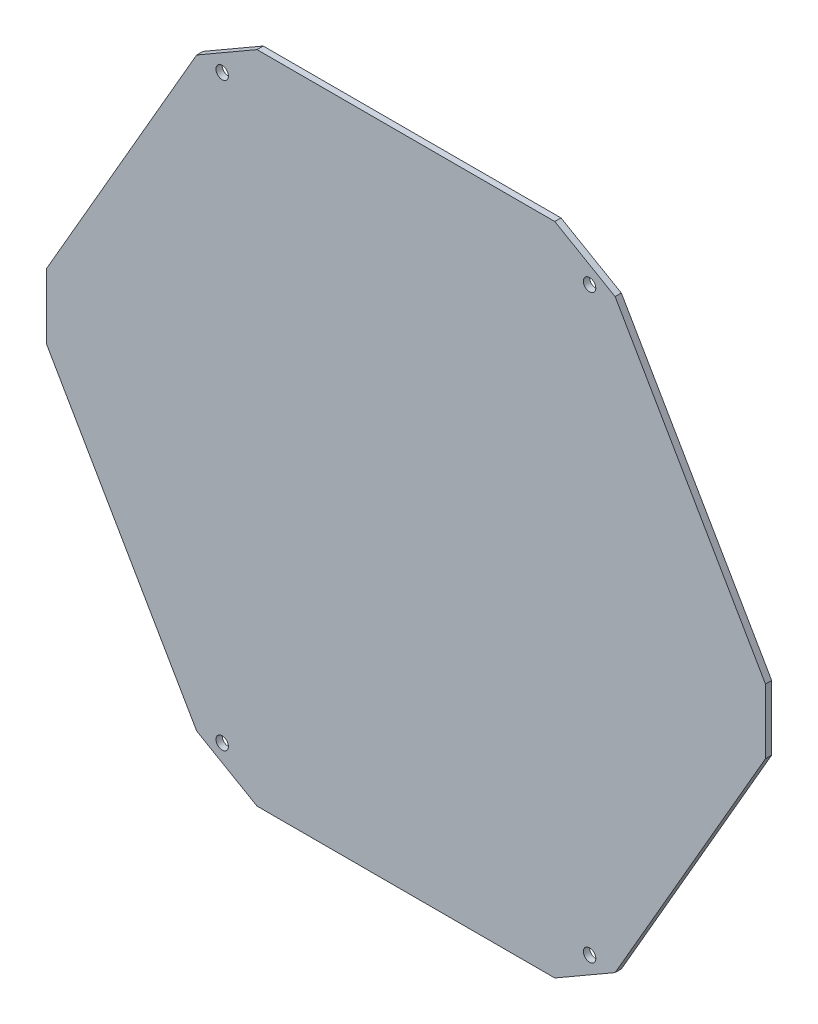
ISO-10303-21;
HEADER;
FILE_DESCRIPTION(('STEP AP214'),'2;1');
FILE_NAME('part.step','',(''),(''),'','','');
FILE_SCHEMA(('AUTOMOTIVE_DESIGN { 1 0 10303 214 1 1 1 1 }'));
ENDSEC;
DATA;
#1=APPLICATION_CONTEXT('core data for automotive mechanical design processes');
#2=APPLICATION_PROTOCOL_DEFINITION('international standard','automotive_design',2000,#1);
#3=PRODUCT_CONTEXT('',#1,'mechanical');
#4=PRODUCT('Part','Part','',(#3));
#5=PRODUCT_RELATED_PRODUCT_CATEGORY('part','',(#4));
#6=PRODUCT_DEFINITION_FORMATION('','',#4);
#7=PRODUCT_DEFINITION_CONTEXT('part definition',#1,'design');
#8=PRODUCT_DEFINITION('design','',#6,#7);
#9=PRODUCT_DEFINITION_SHAPE('','',#8);
#10=(LENGTH_UNIT() NAMED_UNIT(*) SI_UNIT(.MILLI.,.METRE.));
#11=(NAMED_UNIT(*) PLANE_ANGLE_UNIT() SI_UNIT($,.RADIAN.));
#12=(NAMED_UNIT(*) SI_UNIT($,.STERADIAN.) SOLID_ANGLE_UNIT());
#13=UNCERTAINTY_MEASURE_WITH_UNIT(LENGTH_MEASURE(1.E-05),#10,'distance_accuracy_value','');
#14=(GEOMETRIC_REPRESENTATION_CONTEXT(3) GLOBAL_UNCERTAINTY_ASSIGNED_CONTEXT((#13)) GLOBAL_UNIT_ASSIGNED_CONTEXT((#10,
#11,#12)) REPRESENTATION_CONTEXT('',''));
#15=CARTESIAN_POINT('',(0.,0.,0.));
#16=DIRECTION('',(0.,0.,1.));
#17=DIRECTION('',(1.,0.,0.));
#18=AXIS2_PLACEMENT_3D('',#15,#16,#17);
#19=CARTESIAN_POINT('',(0.,0.,2.));
#20=DIRECTION('',(0.,0.,1.));
#21=DIRECTION('',(1.,0.,0.));
#22=AXIS2_PLACEMENT_3D('',#19,#20,#21);
#23=PLANE('',#22);
#24=CARTESIAN_POINT('',(121.525932205,14.9827380707,2.));
#25=DIRECTION('',(0.,0.,1.));
#26=DIRECTION('',(1.,0.,0.));
#27=AXIS2_PLACEMENT_3D('',#24,#25,#26);
#28=CIRCLE('',#27,2.);
#29=CARTESIAN_POINT('',(123.525932205,14.9827380707,2.));
#30=VERTEX_POINT('',#29);
#31=EDGE_CURVE('E142',#30,#30,#28,.F.);
#32=ORIENTED_EDGE('',*,*,#31,.T.);
#33=EDGE_LOOP('',(#32));
#34=FACE_BOUND('',#33,.T.);
#35=CARTESIAN_POINT('',(3.47406779464,14.9827380707,2.));
#36=DIRECTION('',(0.,0.,1.));
#37=DIRECTION('',(1.,0.,0.));
#38=AXIS2_PLACEMENT_3D('',#35,#36,#37);
#39=CIRCLE('',#38,2.);
#40=CARTESIAN_POINT('',(5.47406779464,14.9827380707,2.));
#41=VERTEX_POINT('',#40);
#42=EDGE_CURVE('E145',#41,#41,#39,.F.);
#43=ORIENTED_EDGE('',*,*,#42,.T.);
#44=EDGE_LOOP('',(#43));
#45=FACE_BOUND('',#44,.T.);
#46=CARTESIAN_POINT('',(121.525932205,201.523612875,2.));
#47=DIRECTION('',(0.,0.,1.));
#48=DIRECTION('',(1.,0.,0.));
#49=AXIS2_PLACEMENT_3D('',#46,#47,#48);
#50=CIRCLE('',#49,2.);
#51=CARTESIAN_POINT('',(123.525932205,201.523612875,2.));
#52=VERTEX_POINT('',#51);
#53=EDGE_CURVE('E147',#52,#52,#50,.F.);
#54=ORIENTED_EDGE('',*,*,#53,.T.);
#55=EDGE_LOOP('',(#54));
#56=FACE_BOUND('',#55,.T.);
#57=CARTESIAN_POINT('',(3.47406779464,201.523612875,2.));
#58=DIRECTION('',(0.,0.,1.));
#59=DIRECTION('',(1.,0.,0.));
#60=AXIS2_PLACEMENT_3D('',#57,#58,#59);
#61=CIRCLE('',#60,2.);
#62=CARTESIAN_POINT('',(5.47406779464,201.523612875,2.));
#63=VERTEX_POINT('',#62);
#64=EDGE_CURVE('E20',#63,#63,#61,.F.);
#65=ORIENTED_EDGE('',*,*,#64,.T.);
#66=EDGE_LOOP('',(#65));
#67=FACE_BOUND('',#66,.T.);
#68=DIRECTION('',(0.866025403784329,0.50000000000019,0.));
#69=VECTOR('',#68,1.);
#70=CARTESIAN_POINT('',(-4.73205080757,202.310198523,2.));
#71=LINE('',#70,#69);
#72=CARTESIAN_POINT('',(14.6602540378338,213.506350945941,2.));
#73=VERTEX_POINT('',#72);
#74=CARTESIAN_POINT('',(-4.73205080756524,202.310198522997,2.));
#75=VERTEX_POINT('',#74);
#76=EDGE_CURVE('E166',#73,#75,#71,.F.);
#77=ORIENTED_EDGE('',*,*,#76,.T.);
#78=DIRECTION('',(0.50000000000019,0.866025403784329,0.));
#79=VECTOR('',#78,1.);
#80=CARTESIAN_POINT('',(-53.0358983849,118.645480318,2.));
#81=LINE('',#80,#79);
#82=CARTESIAN_POINT('',(-53.0358983849,118.645480318,2.));
#83=VERTEX_POINT('',#82);
#84=EDGE_CURVE('E121',#75,#83,#81,.F.);
#85=ORIENTED_EDGE('',*,*,#84,.T.);
#86=DIRECTION('',(0.,1.,0.));
#87=VECTOR('',#86,1.);
#88=CARTESIAN_POINT('',(-53.0358983849,97.8608706276,2.));
#89=LINE('',#88,#87);
#90=CARTESIAN_POINT('',(-53.0358983848939,97.8608706276035,2.));
#91=VERTEX_POINT('',#90);
#92=EDGE_CURVE('E117',#83,#91,#89,.F.);
#93=ORIENTED_EDGE('',*,*,#92,.T.);
#94=DIRECTION('',(-0.50000000000019,0.866025403784329,0.));
#95=VECTOR('',#94,1.);
#96=CARTESIAN_POINT('',(-4.73205080757,14.1961524227,2.));
#97=LINE('',#96,#95);
#98=CARTESIAN_POINT('',(-4.73205080757138,14.1961524226976,2.));
#99=VERTEX_POINT('',#98);
#100=EDGE_CURVE('E108',#91,#99,#97,.F.);
#101=ORIENTED_EDGE('',*,*,#100,.T.);
#102=DIRECTION('',(-0.866025403784329,0.50000000000019,0.));
#103=VECTOR('',#102,1.);
#104=CARTESIAN_POINT('',(14.6602540378,3.,2.));
#105=LINE('',#104,#103);
#106=CARTESIAN_POINT('',(14.6602540378,3.,2.));
#107=VERTEX_POINT('',#106);
#108=EDGE_CURVE('E103',#99,#107,#105,.F.);
#109=ORIENTED_EDGE('',*,*,#108,.T.);
#110=DIRECTION('',(-1.,0.,0.));
#111=VECTOR('',#110,1.);
#112=CARTESIAN_POINT('',(110.339745962,3.,2.));
#113=LINE('',#112,#111);
#114=CARTESIAN_POINT('',(110.339745962038,2.99999999993418,2.));
#115=VERTEX_POINT('',#114);
#116=EDGE_CURVE('E206',#107,#115,#113,.F.);
#117=ORIENTED_EDGE('',*,*,#116,.T.);
#118=DIRECTION('',(-0.866025403784329,-0.50000000000019,0.));
#119=VECTOR('',#118,1.);
#120=CARTESIAN_POINT('',(129.732050808,14.1961524227,2.));
#121=LINE('',#120,#119);
#122=CARTESIAN_POINT('',(129.732050807944,14.1961524227322,2.));
#123=VERTEX_POINT('',#122);
#124=EDGE_CURVE('E201',#115,#123,#121,.F.);
#125=ORIENTED_EDGE('',*,*,#124,.T.);
#126=DIRECTION('',(-0.50000000000019,-0.866025403784329,0.));
#127=VECTOR('',#126,1.);
#128=CARTESIAN_POINT('',(178.035898385,97.8608706276,2.));
#129=LINE('',#128,#127);
#130=CARTESIAN_POINT('',(178.035898385,97.8608706276,2.));
#131=VERTEX_POINT('',#130);
#132=EDGE_CURVE('E195',#123,#131,#129,.F.);
#133=ORIENTED_EDGE('',*,*,#132,.T.);
#134=DIRECTION('',(0.,1.,0.));
#135=VECTOR('',#134,1.);
#136=CARTESIAN_POINT('',(178.035898385,118.645480318,2.));
#137=LINE('',#136,#135);
#138=CARTESIAN_POINT('',(178.035898385067,118.645480318038,2.));
#139=VERTEX_POINT('',#138);
#140=EDGE_CURVE('E189',#131,#139,#137,.T.);
#141=ORIENTED_EDGE('',*,*,#140,.T.);
#142=DIRECTION('',(0.50000000000019,-0.866025403784329,0.));
#143=VECTOR('',#142,1.);
#144=CARTESIAN_POINT('',(129.732050808,202.310198523,2.));
#145=LINE('',#144,#143);
#146=CARTESIAN_POINT('',(129.732050807994,202.31019852299,2.));
#147=VERTEX_POINT('',#146);
#148=EDGE_CURVE('E183',#139,#147,#145,.F.);
#149=ORIENTED_EDGE('',*,*,#148,.T.);
#150=DIRECTION('',(0.866025403784329,-0.50000000000019,0.));
#151=VECTOR('',#150,1.);
#152=CARTESIAN_POINT('',(110.339745962,213.506350946,2.));
#153=LINE('',#152,#151);
#154=CARTESIAN_POINT('',(110.339745962,213.506350946,2.));
#155=VERTEX_POINT('',#154);
#156=EDGE_CURVE('E177',#147,#155,#153,.F.);
#157=ORIENTED_EDGE('',*,*,#156,.T.);
#158=DIRECTION('',(1.,0.,0.));
#159=VECTOR('',#158,1.);
#160=CARTESIAN_POINT('',(14.6602540378,213.506350946,2.));
#161=LINE('',#160,#159);
#162=EDGE_CURVE('E171',#155,#73,#161,.F.);
#163=ORIENTED_EDGE('',*,*,#162,.T.);
#164=EDGE_LOOP('',(#77,#85,#93,#101,#109,#117,#125,#133,#141,#149,#157,#163));
#165=FACE_BOUND('',#164,.T.);
#166=ADVANCED_FACE('F17',(#34,#45,#56,#67,#165),#23,.T.);
#167=CARTESIAN_POINT('',(-53.0358983849,97.8608706276,0.));
#168=DIRECTION('',(1.,0.,0.));
#169=DIRECTION('',(0.,0.,-1.));
#170=AXIS2_PLACEMENT_3D('',#167,#168,#169);
#171=PLANE('',#170);
#172=DIRECTION('',(0.,1.,0.));
#173=VECTOR('',#172,1.);
#174=CARTESIAN_POINT('',(-53.0358983849,0.,0.));
#175=LINE('',#174,#173);
#176=CARTESIAN_POINT('',(-53.0358983849,118.645480318,0.));
#177=VERTEX_POINT('',#176);
#178=CARTESIAN_POINT('',(-53.0358983848939,97.8608706276035,0.));
#179=VERTEX_POINT('',#178);
#180=EDGE_CURVE('E128',#177,#179,#175,.F.);
#181=ORIENTED_EDGE('',*,*,#180,.T.);
#182=DIRECTION('',(0.,0.,1.));
#183=VECTOR('',#182,1.);
#184=CARTESIAN_POINT('',(-53.0358983848758,97.860870627614,0.));
#185=LINE('',#184,#183);
#186=EDGE_CURVE('E113',#179,#91,#185,.T.);
#187=ORIENTED_EDGE('',*,*,#186,.T.);
#188=ORIENTED_EDGE('',*,*,#92,.F.);
#189=DIRECTION('',(0.,0.,1.));
#190=VECTOR('',#189,1.);
#191=CARTESIAN_POINT('',(-53.0358983849,118.645480318,0.));
#192=LINE('',#191,#190);
#193=EDGE_CURVE('E154',#83,#177,#192,.F.);
#194=ORIENTED_EDGE('',*,*,#193,.T.);
#195=EDGE_LOOP('',(#181,#187,#188,#194));
#196=FACE_BOUND('',#195,.T.);
#197=ADVANCED_FACE('F127',(#196),#171,.F.);
#198=CARTESIAN_POINT('',(-4.73205080757,14.1961524227,0.));
#199=DIRECTION('',(0.866025403784329,0.50000000000019,0.));
#200=DIRECTION('',(-0.50000000000019,0.866025403784329,0.));
#201=AXIS2_PLACEMENT_3D('',#198,#199,#200);
#202=PLANE('',#201);
#203=DIRECTION('',(0.500000000000441,-0.866025403784184,0.));
#204=VECTOR('',#203,1.);
#205=CARTESIAN_POINT('',(-53.0358983849,97.8608706276,0.));
#206=LINE('',#205,#204);
#207=CARTESIAN_POINT('',(-4.73205080757138,14.1961524226976,0.));
#208=VERTEX_POINT('',#207);
#209=EDGE_CURVE('E234',#179,#208,#206,.T.);
#210=ORIENTED_EDGE('',*,*,#209,.T.);
#211=DIRECTION('',(0.,0.,1.));
#212=VECTOR('',#211,1.);
#213=CARTESIAN_POINT('',(-4.73205080757549,14.1961524226905,0.));
#214=LINE('',#213,#212);
#215=EDGE_CURVE('E115',#208,#99,#214,.T.);
#216=ORIENTED_EDGE('',*,*,#215,.T.);
#217=ORIENTED_EDGE('',*,*,#100,.F.);
#218=ORIENTED_EDGE('',*,*,#186,.F.);
#219=EDGE_LOOP('',(#210,#216,#217,#218));
#220=FACE_BOUND('',#219,.T.);
#221=ADVANCED_FACE('F111',(#220),#202,.F.);
#222=CARTESIAN_POINT('',(14.6602540378,3.,0.));
#223=DIRECTION('',(0.50000000000019,0.866025403784329,0.));
#224=DIRECTION('',(-0.866025403784329,0.50000000000019,0.));
#225=AXIS2_PLACEMENT_3D('',#222,#223,#224);
#226=PLANE('',#225);
#227=DIRECTION('',(0.866025403784084,-0.500000000000615,0.));
#228=VECTOR('',#227,1.);
#229=CARTESIAN_POINT('',(-4.73205080757,14.1961524227,0.));
#230=LINE('',#229,#228);
#231=CARTESIAN_POINT('',(14.6602540378,3.,0.));
#232=VERTEX_POINT('',#231);
#233=EDGE_CURVE('E230',#208,#232,#230,.T.);
#234=ORIENTED_EDGE('',*,*,#233,.T.);
#235=DIRECTION('',(0.,0.,1.));
#236=VECTOR('',#235,1.);
#237=CARTESIAN_POINT('',(14.6602540378,2.99999999999999,0.));
#238=LINE('',#237,#236);
#239=EDGE_CURVE('E204',#232,#107,#238,.T.);
#240=ORIENTED_EDGE('',*,*,#239,.T.);
#241=ORIENTED_EDGE('',*,*,#108,.F.);
#242=ORIENTED_EDGE('',*,*,#215,.F.);
#243=EDGE_LOOP('',(#234,#240,#241,#242));
#244=FACE_BOUND('',#243,.T.);
#245=ADVANCED_FACE('F235',(#244),#226,.F.);
#246=CARTESIAN_POINT('',(110.339745962,3.,0.));
#247=DIRECTION('',(0.,1.,0.));
#248=DIRECTION('',(-1.,0.,0.));
#249=AXIS2_PLACEMENT_3D('',#246,#247,#248);
#250=PLANE('',#249);
#251=DIRECTION('',(1.,0.,0.));
#252=VECTOR('',#251,1.);
#253=CARTESIAN_POINT('',(0.,3.,0.));
#254=LINE('',#253,#252);
#255=CARTESIAN_POINT('',(110.339745962038,2.99999999993418,0.));
#256=VERTEX_POINT('',#255);
#257=EDGE_CURVE('E212',#232,#256,#254,.T.);
#258=ORIENTED_EDGE('',*,*,#257,.T.);
#259=DIRECTION('',(0.,0.,1.));
#260=VECTOR('',#259,1.);
#261=CARTESIAN_POINT('',(110.339745962152,2.99999999973671,0.));
#262=LINE('',#261,#260);
#263=EDGE_CURVE('E198',#256,#115,#262,.T.);
#264=ORIENTED_EDGE('',*,*,#263,.T.);
#265=ORIENTED_EDGE('',*,*,#116,.F.);
#266=ORIENTED_EDGE('',*,*,#239,.F.);
#267=EDGE_LOOP('',(#258,#264,#265,#266));
#268=FACE_BOUND('',#267,.T.);
#269=ADVANCED_FACE('F210',(#268),#250,.F.);
#270=CARTESIAN_POINT('',(129.732050808,14.1961524227,0.));
#271=DIRECTION('',(-0.50000000000019,0.866025403784329,0.));
#272=DIRECTION('',(-0.866025403784329,-0.50000000000019,0.));
#273=AXIS2_PLACEMENT_3D('',#270,#271,#272);
#274=PLANE('',#273);
#275=DIRECTION('',(0.866025403791117,0.499999999988432,0.));
#276=VECTOR('',#275,1.);
#277=CARTESIAN_POINT('',(110.339745962,3.,0.));
#278=LINE('',#277,#276);
#279=CARTESIAN_POINT('',(129.732050807944,14.1961524227322,0.));
#280=VERTEX_POINT('',#279);
#281=EDGE_CURVE('E217',#256,#280,#278,.T.);
#282=ORIENTED_EDGE('',*,*,#281,.T.);
#283=DIRECTION('',(0.,0.,1.));
#284=VECTOR('',#283,1.);
#285=CARTESIAN_POINT('',(129.732050807777,14.1961524228289,0.));
#286=LINE('',#285,#284);
#287=EDGE_CURVE('E192',#280,#123,#286,.T.);
#288=ORIENTED_EDGE('',*,*,#287,.T.);
#289=ORIENTED_EDGE('',*,*,#124,.F.);
#290=ORIENTED_EDGE('',*,*,#263,.F.);
#291=EDGE_LOOP('',(#282,#288,#289,#290));
#292=FACE_BOUND('',#291,.T.);
#293=ADVANCED_FACE('F216',(#292),#274,.F.);
#294=CARTESIAN_POINT('',(178.035898385,97.8608706276,0.));
#295=DIRECTION('',(-0.866025403784329,0.50000000000019,0.));
#296=DIRECTION('',(-0.50000000000019,-0.866025403784329,0.));
#297=AXIS2_PLACEMENT_3D('',#294,#295,#296);
#298=PLANE('',#297);
#299=DIRECTION('',(0.499999999997879,0.866025403785663,0.));
#300=VECTOR('',#299,1.);
#301=CARTESIAN_POINT('',(129.732050808,14.1961524227,0.));
#302=LINE('',#301,#300);
#303=CARTESIAN_POINT('',(178.035898385,97.8608706276,0.));
#304=VERTEX_POINT('',#303);
#305=EDGE_CURVE('E226',#280,#304,#302,.T.);
#306=ORIENTED_EDGE('',*,*,#305,.T.);
#307=DIRECTION('',(0.,0.,1.));
#308=VECTOR('',#307,1.);
#309=CARTESIAN_POINT('',(178.035898385,97.8608706276,0.));
#310=LINE('',#309,#308);
#311=EDGE_CURVE('E186',#304,#131,#310,.T.);
#312=ORIENTED_EDGE('',*,*,#311,.T.);
#313=ORIENTED_EDGE('',*,*,#132,.F.);
#314=ORIENTED_EDGE('',*,*,#287,.F.);
#315=EDGE_LOOP('',(#306,#312,#313,#314));
#316=FACE_BOUND('',#315,.T.);
#317=ADVANCED_FACE('F290',(#316),#298,.F.);
#318=CARTESIAN_POINT('',(178.035898385,118.645480318,0.));
#319=DIRECTION('',(-1.,0.,0.));
#320=DIRECTION('',(0.,0.,1.));
#321=AXIS2_PLACEMENT_3D('',#318,#319,#320);
#322=PLANE('',#321);
#323=DIRECTION('',(0.,1.,0.));
#324=VECTOR('',#323,1.);
#325=CARTESIAN_POINT('',(178.035898385,0.,0.));
#326=LINE('',#325,#324);
#327=CARTESIAN_POINT('',(178.035898385067,118.645480318038,0.));
#328=VERTEX_POINT('',#327);
#329=EDGE_CURVE('E228',#304,#328,#326,.T.);
#330=ORIENTED_EDGE('',*,*,#329,.T.);
#331=DIRECTION('',(0.,0.,1.));
#332=VECTOR('',#331,1.);
#333=CARTESIAN_POINT('',(178.035898385267,118.645480318154,0.));
#334=LINE('',#333,#332);
#335=EDGE_CURVE('E180',#328,#139,#334,.T.);
#336=ORIENTED_EDGE('',*,*,#335,.T.);
#337=ORIENTED_EDGE('',*,*,#140,.F.);
#338=ORIENTED_EDGE('',*,*,#311,.F.);
#339=EDGE_LOOP('',(#330,#336,#337,#338));
#340=FACE_BOUND('',#339,.T.);
#341=ADVANCED_FACE('F286',(#340),#322,.F.);
#342=CARTESIAN_POINT('',(129.732050808,202.310198523,0.));
#343=DIRECTION('',(-0.866025403784329,-0.50000000000019,0.));
#344=DIRECTION('',(0.50000000000019,-0.866025403784329,0.));
#345=AXIS2_PLACEMENT_3D('',#342,#343,#344);
#346=PLANE('',#345);
#347=DIRECTION('',(-0.499999999997431,0.866025403785922,0.));
#348=VECTOR('',#347,1.);
#349=CARTESIAN_POINT('',(178.035898385,118.645480318,0.));
#350=LINE('',#349,#348);
#351=CARTESIAN_POINT('',(129.732050807994,202.31019852299,0.));
#352=VERTEX_POINT('',#351);
#353=EDGE_CURVE('E418',#328,#352,#350,.T.);
#354=ORIENTED_EDGE('',*,*,#353,.T.);
#355=DIRECTION('',(0.,0.,1.));
#356=VECTOR('',#355,1.);
#357=CARTESIAN_POINT('',(129.732050807978,202.310198522962,0.));
#358=LINE('',#357,#356);
#359=EDGE_CURVE('E174',#352,#147,#358,.T.);
#360=ORIENTED_EDGE('',*,*,#359,.T.);
#361=ORIENTED_EDGE('',*,*,#148,.F.);
#362=ORIENTED_EDGE('',*,*,#335,.F.);
#363=EDGE_LOOP('',(#354,#360,#361,#362));
#364=FACE_BOUND('',#363,.T.);
#365=ADVANCED_FACE('F282',(#364),#346,.F.);
#366=CARTESIAN_POINT('',(110.339745962,213.506350946,0.));
#367=DIRECTION('',(-0.50000000000019,-0.866025403784329,0.));
#368=DIRECTION('',(0.866025403784329,-0.50000000000019,0.));
#369=AXIS2_PLACEMENT_3D('',#366,#367,#368);
#370=PLANE('',#369);
#371=DIRECTION('',(-0.866025403785316,0.49999999999848,0.));
#372=VECTOR('',#371,1.);
#373=CARTESIAN_POINT('',(129.732050808,202.310198523,0.));
#374=LINE('',#373,#372);
#375=CARTESIAN_POINT('',(110.339745962,213.506350946,0.));
#376=VERTEX_POINT('',#375);
#377=EDGE_CURVE('E422',#352,#376,#374,.T.);
#378=ORIENTED_EDGE('',*,*,#377,.T.);
#379=DIRECTION('',(0.,0.,-1.));
#380=VECTOR('',#379,1.);
#381=CARTESIAN_POINT('',(110.339745962,213.506350946,0.));
#382=LINE('',#381,#380);
#383=EDGE_CURVE('E168',#376,#155,#382,.F.);
#384=ORIENTED_EDGE('',*,*,#383,.T.);
#385=ORIENTED_EDGE('',*,*,#156,.F.);
#386=ORIENTED_EDGE('',*,*,#359,.F.);
#387=EDGE_LOOP('',(#378,#384,#385,#386));
#388=FACE_BOUND('',#387,.T.);
#389=ADVANCED_FACE('F278',(#388),#370,.F.);
#390=CARTESIAN_POINT('',(14.6602540378,213.506350946,0.));
#391=DIRECTION('',(0.,-1.,0.));
#392=DIRECTION('',(0.,0.,-1.));
#393=AXIS2_PLACEMENT_3D('',#390,#391,#392);
#394=PLANE('',#393);
#395=DIRECTION('',(1.,0.,0.));
#396=VECTOR('',#395,1.);
#397=CARTESIAN_POINT('',(0.,213.506350946,0.));
#398=LINE('',#397,#396);
#399=CARTESIAN_POINT('',(14.6602540378338,213.506350945941,0.));
#400=VERTEX_POINT('',#399);
#401=EDGE_CURVE('E424',#376,#400,#398,.F.);
#402=ORIENTED_EDGE('',*,*,#401,.T.);
#403=DIRECTION('',(0.,0.,1.));
#404=VECTOR('',#403,1.);
#405=CARTESIAN_POINT('',(14.6602540379354,213.506350945766,0.));
#406=LINE('',#405,#404);
#407=EDGE_CURVE('E163',#400,#73,#406,.T.);
#408=ORIENTED_EDGE('',*,*,#407,.T.);
#409=ORIENTED_EDGE('',*,*,#162,.F.);
#410=ORIENTED_EDGE('',*,*,#383,.F.);
#411=EDGE_LOOP('',(#402,#408,#409,#410));
#412=FACE_BOUND('',#411,.T.);
#413=ADVANCED_FACE('F275',(#412),#394,.F.);
#414=CARTESIAN_POINT('',(-4.73205080757,202.310198523,0.));
#415=DIRECTION('',(0.50000000000019,-0.866025403784329,0.));
#416=DIRECTION('',(0.866025403784329,0.50000000000019,0.));
#417=AXIS2_PLACEMENT_3D('',#414,#415,#416);
#418=PLANE('',#417);
#419=DIRECTION('',(-0.866025403778283,-0.500000000010663,0.));
#420=VECTOR('',#419,1.);
#421=CARTESIAN_POINT('',(14.6602540378,213.506350946,0.));
#422=LINE('',#421,#420);
#423=CARTESIAN_POINT('',(-4.73205080756524,202.310198522997,0.));
#424=VERTEX_POINT('',#423);
#425=EDGE_CURVE('E429',#400,#424,#422,.T.);
#426=ORIENTED_EDGE('',*,*,#425,.T.);
#427=DIRECTION('',(0.,0.,1.));
#428=VECTOR('',#427,1.);
#429=CARTESIAN_POINT('',(-4.73205080755094,202.310198522989,0.));
#430=LINE('',#429,#428);
#431=EDGE_CURVE('E35',#424,#75,#430,.T.);
#432=ORIENTED_EDGE('',*,*,#431,.T.);
#433=ORIENTED_EDGE('',*,*,#76,.F.);
#434=ORIENTED_EDGE('',*,*,#407,.F.);
#435=EDGE_LOOP('',(#426,#432,#433,#434));
#436=FACE_BOUND('',#435,.T.);
#437=ADVANCED_FACE('F272',(#436),#418,.F.);
#438=CARTESIAN_POINT('',(-53.0358983849,118.645480318,0.));
#439=DIRECTION('',(0.866025403784329,-0.50000000000019,0.));
#440=DIRECTION('',(0.50000000000019,0.866025403784329,0.));
#441=AXIS2_PLACEMENT_3D('',#438,#439,#440);
#442=PLANE('',#441);
#443=DIRECTION('',(-0.499999999999993,-0.866025403784443,0.));
#444=VECTOR('',#443,1.);
#445=CARTESIAN_POINT('',(-4.73205080757,202.310198523,0.));
#446=LINE('',#445,#444);
#447=EDGE_CURVE('E141',#424,#177,#446,.T.);
#448=ORIENTED_EDGE('',*,*,#447,.T.);
#449=ORIENTED_EDGE('',*,*,#193,.F.);
#450=ORIENTED_EDGE('',*,*,#84,.F.);
#451=ORIENTED_EDGE('',*,*,#431,.F.);
#452=EDGE_LOOP('',(#448,#449,#450,#451));
#453=FACE_BOUND('',#452,.T.);
#454=ADVANCED_FACE('F268',(#453),#442,.F.);
#455=CARTESIAN_POINT('',(3.47406779464,201.523612875,1.));
#456=DIRECTION('',(0.,0.,1.));
#457=DIRECTION('',(1.,0.,0.));
#458=AXIS2_PLACEMENT_3D('',#455,#456,#457);
#459=CYLINDRICAL_SURFACE('',#458,2.);
#460=CARTESIAN_POINT('',(3.47406779464,201.523612875,0.));
#461=DIRECTION('',(0.,0.,1.));
#462=DIRECTION('',(1.,0.,0.));
#463=AXIS2_PLACEMENT_3D('',#460,#461,#462);
#464=CIRCLE('',#463,2.);
#465=CARTESIAN_POINT('',(5.47406779464,201.523612875,0.));
#466=VERTEX_POINT('',#465);
#467=EDGE_CURVE('E138',#466,#466,#464,.F.);
#468=ORIENTED_EDGE('',*,*,#467,.T.);
#469=EDGE_LOOP('',(#468));
#470=FACE_BOUND('',#469,.T.);
#471=ORIENTED_EDGE('',*,*,#64,.F.);
#472=EDGE_LOOP('',(#471));
#473=FACE_BOUND('',#472,.T.);
#474=ADVANCED_FACE('F264',(#470,#473),#459,.F.);
#475=CARTESIAN_POINT('',(121.525932205,201.523612875,1.));
#476=DIRECTION('',(0.,0.,1.));
#477=DIRECTION('',(1.,0.,0.));
#478=AXIS2_PLACEMENT_3D('',#475,#476,#477);
#479=CYLINDRICAL_SURFACE('',#478,2.);
#480=CARTESIAN_POINT('',(121.525932205,201.523612875,0.));
#481=DIRECTION('',(0.,0.,1.));
#482=DIRECTION('',(1.,0.,0.));
#483=AXIS2_PLACEMENT_3D('',#480,#481,#482);
#484=CIRCLE('',#483,2.);
#485=CARTESIAN_POINT('',(123.525932205,201.523612875,0.));
#486=VERTEX_POINT('',#485);
#487=EDGE_CURVE('E135',#486,#486,#484,.F.);
#488=ORIENTED_EDGE('',*,*,#487,.T.);
#489=EDGE_LOOP('',(#488));
#490=FACE_BOUND('',#489,.T.);
#491=ORIENTED_EDGE('',*,*,#53,.F.);
#492=EDGE_LOOP('',(#491));
#493=FACE_BOUND('',#492,.T.);
#494=ADVANCED_FACE('F260',(#490,#493),#479,.F.);
#495=CARTESIAN_POINT('',(3.47406779464,14.9827380707,1.));
#496=DIRECTION('',(0.,0.,1.));
#497=DIRECTION('',(1.,0.,0.));
#498=AXIS2_PLACEMENT_3D('',#495,#496,#497);
#499=CYLINDRICAL_SURFACE('',#498,2.);
#500=CARTESIAN_POINT('',(3.47406779464,14.9827380707,0.));
#501=DIRECTION('',(0.,0.,1.));
#502=DIRECTION('',(1.,0.,0.));
#503=AXIS2_PLACEMENT_3D('',#500,#501,#502);
#504=CIRCLE('',#503,2.);
#505=CARTESIAN_POINT('',(5.47406779464,14.9827380707,0.));
#506=VERTEX_POINT('',#505);
#507=EDGE_CURVE('E26',#506,#506,#504,.F.);
#508=ORIENTED_EDGE('',*,*,#507,.T.);
#509=EDGE_LOOP('',(#508));
#510=FACE_BOUND('',#509,.T.);
#511=ORIENTED_EDGE('',*,*,#42,.F.);
#512=EDGE_LOOP('',(#511));
#513=FACE_BOUND('',#512,.T.);
#514=ADVANCED_FACE('F252',(#510,#513),#499,.F.);
#515=CARTESIAN_POINT('',(121.525932205,14.9827380707,1.));
#516=DIRECTION('',(0.,0.,1.));
#517=DIRECTION('',(1.,0.,0.));
#518=AXIS2_PLACEMENT_3D('',#515,#516,#517);
#519=CYLINDRICAL_SURFACE('',#518,2.);
#520=CARTESIAN_POINT('',(121.525932205,14.9827380707,0.));
#521=DIRECTION('',(0.,0.,1.));
#522=DIRECTION('',(1.,0.,0.));
#523=AXIS2_PLACEMENT_3D('',#520,#521,#522);
#524=CIRCLE('',#523,2.);
#525=CARTESIAN_POINT('',(123.525932205,14.9827380707,0.));
#526=VERTEX_POINT('',#525);
#527=EDGE_CURVE('E11',#526,#526,#524,.F.);
#528=ORIENTED_EDGE('',*,*,#527,.T.);
#529=EDGE_LOOP('',(#528));
#530=FACE_BOUND('',#529,.T.);
#531=ORIENTED_EDGE('',*,*,#31,.F.);
#532=EDGE_LOOP('',(#531));
#533=FACE_BOUND('',#532,.T.);
#534=ADVANCED_FACE('F246',(#530,#533),#519,.F.);
#535=CARTESIAN_POINT('',(0.,0.,0.));
#536=DIRECTION('',(0.,0.,1.));
#537=DIRECTION('',(1.,0.,0.));
#538=AXIS2_PLACEMENT_3D('',#535,#536,#537);
#539=PLANE('',#538);
#540=ORIENTED_EDGE('',*,*,#527,.F.);
#541=EDGE_LOOP('',(#540));
#542=FACE_BOUND('',#541,.T.);
#543=ORIENTED_EDGE('',*,*,#507,.F.);
#544=EDGE_LOOP('',(#543));
#545=FACE_BOUND('',#544,.T.);
#546=ORIENTED_EDGE('',*,*,#487,.F.);
#547=EDGE_LOOP('',(#546));
#548=FACE_BOUND('',#547,.T.);
#549=ORIENTED_EDGE('',*,*,#467,.F.);
#550=EDGE_LOOP('',(#549));
#551=FACE_BOUND('',#550,.T.);
#552=ORIENTED_EDGE('',*,*,#425,.F.);
#553=ORIENTED_EDGE('',*,*,#401,.F.);
#554=ORIENTED_EDGE('',*,*,#377,.F.);
#555=ORIENTED_EDGE('',*,*,#353,.F.);
#556=ORIENTED_EDGE('',*,*,#329,.F.);
#557=ORIENTED_EDGE('',*,*,#305,.F.);
#558=ORIENTED_EDGE('',*,*,#281,.F.);
#559=ORIENTED_EDGE('',*,*,#257,.F.);
#560=ORIENTED_EDGE('',*,*,#233,.F.);
#561=ORIENTED_EDGE('',*,*,#209,.F.);
#562=ORIENTED_EDGE('',*,*,#180,.F.);
#563=ORIENTED_EDGE('',*,*,#447,.F.);
#564=EDGE_LOOP('',(#552,#553,#554,#555,#556,#557,#558,#559,#560,#561,#562,#563));
#565=FACE_BOUND('',#564,.T.);
#566=ADVANCED_FACE('F221',(#542,#545,#548,#551,#565),#539,.F.);
#567=CLOSED_SHELL('',(#166,#197,#221,#245,#269,#293,#317,#341,#365,#389,#413,#437,#454,#474,
#494,#514,#534,#566));
#568=MANIFOLD_SOLID_BREP('B1',#567);
#569=ADVANCED_BREP_SHAPE_REPRESENTATION('',(#18,#568),#14);
#570=SHAPE_DEFINITION_REPRESENTATION(#9,#569);
ENDSEC;
END-ISO-10303-21;
